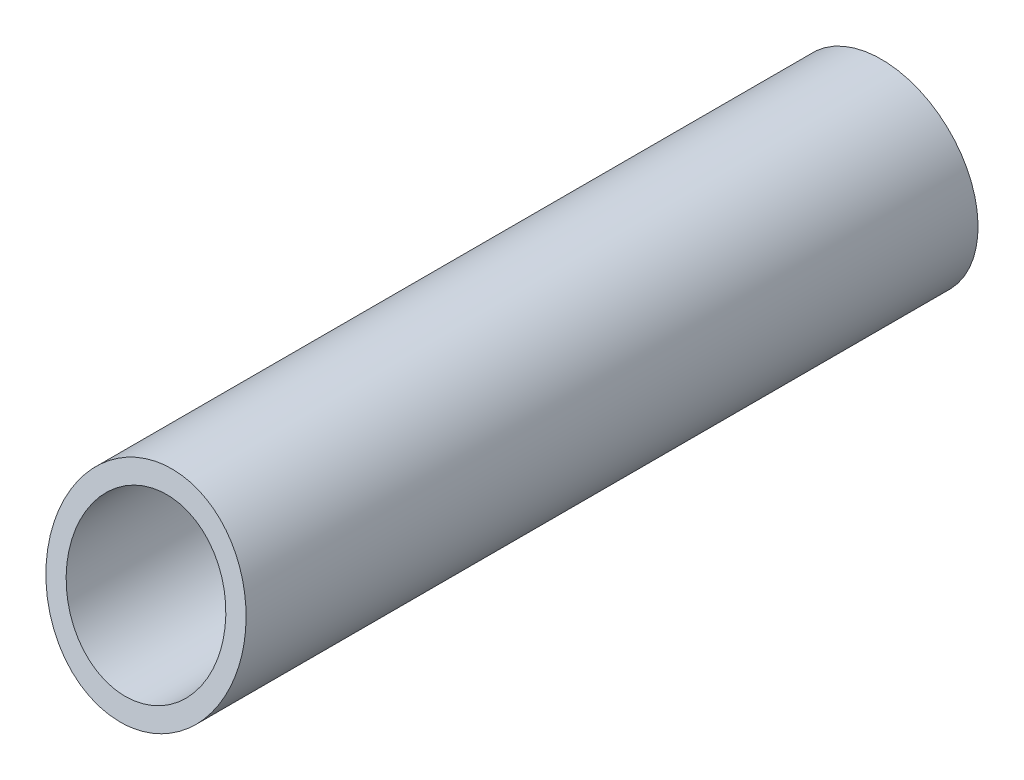
ISO-10303-21;
HEADER;
FILE_DESCRIPTION(('STEP AP214'),'2;1');
FILE_NAME('part.step','',(''),(''),'','','');
FILE_SCHEMA(('AUTOMOTIVE_DESIGN { 1 0 10303 214 1 1 1 1 }'));
ENDSEC;
DATA;
#1=APPLICATION_CONTEXT('core data for automotive mechanical design processes');
#2=APPLICATION_PROTOCOL_DEFINITION('international standard','automotive_design',2000,#1);
#3=PRODUCT_CONTEXT('',#1,'mechanical');
#4=PRODUCT('Part','Part','',(#3));
#5=PRODUCT_RELATED_PRODUCT_CATEGORY('part','',(#4));
#6=PRODUCT_DEFINITION_FORMATION('','',#4);
#7=PRODUCT_DEFINITION_CONTEXT('part definition',#1,'design');
#8=PRODUCT_DEFINITION('design','',#6,#7);
#9=PRODUCT_DEFINITION_SHAPE('','',#8);
#10=(LENGTH_UNIT() NAMED_UNIT(*) SI_UNIT(.MILLI.,.METRE.));
#11=(NAMED_UNIT(*) PLANE_ANGLE_UNIT() SI_UNIT($,.RADIAN.));
#12=(NAMED_UNIT(*) SI_UNIT($,.STERADIAN.) SOLID_ANGLE_UNIT());
#13=UNCERTAINTY_MEASURE_WITH_UNIT(LENGTH_MEASURE(1.E-05),#10,'distance_accuracy_value','');
#14=(GEOMETRIC_REPRESENTATION_CONTEXT(3) GLOBAL_UNCERTAINTY_ASSIGNED_CONTEXT((#13)) GLOBAL_UNIT_ASSIGNED_CONTEXT((#10,
#11,#12)) REPRESENTATION_CONTEXT('',''));
#15=CARTESIAN_POINT('',(0.,0.,0.));
#16=DIRECTION('',(0.,0.,1.));
#17=DIRECTION('',(1.,0.,0.));
#18=AXIS2_PLACEMENT_3D('',#15,#16,#17);
#19=CARTESIAN_POINT('',(0.,31.7500000000006,118.492613140312));
#20=DIRECTION('',(0.,-0.258819045102526,-0.965925826289067));
#21=DIRECTION('',(0.,0.965925826289067,-0.258819045102526));
#22=AXIS2_PLACEMENT_3D('',#19,#20,#21);
#23=PLANE('',#22);
#24=CARTESIAN_POINT('',(0.,0.,127.));
#25=DIRECTION('',(0.,-0.258819045102526,-0.965925826289067));
#26=DIRECTION('',(0.,-0.965925826289067,0.258819045102526));
#27=AXIS2_PLACEMENT_3D('',#24,#25,#26);
#28=ELLIPSE('',#27,17.2896298509386,16.7005);
#29=CARTESIAN_POINT('',(0.,-16.7005,131.474885488196));
#30=VERTEX_POINT('',#29);
#31=EDGE_CURVE('E22',#30,#30,#28,.T.);
#32=ORIENTED_EDGE('',*,*,#31,.F.);
#33=EDGE_LOOP('',(#32));
#34=FACE_BOUND('',#33,.T.);
#35=CARTESIAN_POINT('',(0.,0.,127.));
#36=DIRECTION('',(0.,0.258819045102526,0.965925826289067));
#37=DIRECTION('',(0.,-0.965925826289067,0.258819045102526));
#38=AXIS2_PLACEMENT_3D('',#35,#36,#37);
#39=ELLIPSE('',#38,13.7922598582773,13.3223);
#40=CARTESIAN_POINT('',(0.,-13.3223,130.569699526325));
#41=VERTEX_POINT('',#40);
#42=EDGE_CURVE('E9',#41,#41,#39,.T.);
#43=ORIENTED_EDGE('',*,*,#42,.F.);
#44=EDGE_LOOP('',(#43));
#45=FACE_BOUND('',#44,.T.);
#46=ADVANCED_FACE('F14',(#34,#45),#23,.F.);
#47=CARTESIAN_POINT('',(0.,0.,0.));
#48=DIRECTION('',(0.,0.,1.));
#49=DIRECTION('',(1.,0.,0.));
#50=AXIS2_PLACEMENT_3D('',#47,#48,#49);
#51=CYLINDRICAL_SURFACE('',#50,13.3223);
#52=ORIENTED_EDGE('',*,*,#42,.T.);
#53=EDGE_LOOP('',(#52));
#54=FACE_BOUND('',#53,.T.);
#55=CARTESIAN_POINT('',(0.,0.,0.));
#56=DIRECTION('',(0.,0.,1.));
#57=DIRECTION('',(1.,0.,0.));
#58=AXIS2_PLACEMENT_3D('',#55,#56,#57);
#59=CIRCLE('',#58,13.3223);
#60=CARTESIAN_POINT('',(13.3223,0.,0.));
#61=VERTEX_POINT('',#60);
#62=EDGE_CURVE('E28',#61,#61,#59,.T.);
#63=ORIENTED_EDGE('',*,*,#62,.F.);
#64=EDGE_LOOP('',(#63));
#65=FACE_BOUND('',#64,.T.);
#66=ADVANCED_FACE('F38',(#54,#65),#51,.F.);
#67=CARTESIAN_POINT('',(0.,0.,0.));
#68=DIRECTION('',(0.,0.,1.));
#69=DIRECTION('',(1.,0.,0.));
#70=AXIS2_PLACEMENT_3D('',#67,#68,#69);
#71=CYLINDRICAL_SURFACE('',#70,16.7005);
#72=ORIENTED_EDGE('',*,*,#31,.T.);
#73=EDGE_LOOP('',(#72));
#74=FACE_BOUND('',#73,.T.);
#75=CARTESIAN_POINT('',(0.,0.,0.));
#76=DIRECTION('',(0.,0.,-1.));
#77=DIRECTION('',(0.,-1.,0.));
#78=AXIS2_PLACEMENT_3D('',#75,#76,#77);
#79=CIRCLE('',#78,16.7005);
#80=CARTESIAN_POINT('',(0.,-16.7005,0.));
#81=VERTEX_POINT('',#80);
#82=EDGE_CURVE('E18',#81,#81,#79,.T.);
#83=ORIENTED_EDGE('',*,*,#82,.F.);
#84=EDGE_LOOP('',(#83));
#85=FACE_BOUND('',#84,.T.);
#86=ADVANCED_FACE('F16',(#74,#85),#71,.T.);
#87=CARTESIAN_POINT('',(0.,0.,0.));
#88=DIRECTION('',(0.,0.,1.));
#89=DIRECTION('',(1.,0.,0.));
#90=AXIS2_PLACEMENT_3D('',#87,#88,#89);
#91=PLANE('',#90);
#92=ORIENTED_EDGE('',*,*,#82,.T.);
#93=EDGE_LOOP('',(#92));
#94=FACE_BOUND('',#93,.T.);
#95=ORIENTED_EDGE('',*,*,#62,.T.);
#96=EDGE_LOOP('',(#95));
#97=FACE_BOUND('',#96,.T.);
#98=ADVANCED_FACE('F35',(#94,#97),#91,.F.);
#99=CLOSED_SHELL('',(#46,#66,#86,#98));
#100=MANIFOLD_SOLID_BREP('B1',#99);
#101=ADVANCED_BREP_SHAPE_REPRESENTATION('',(#18,#100),#14);
#102=SHAPE_DEFINITION_REPRESENTATION(#9,#101);
ENDSEC;
END-ISO-10303-21;
